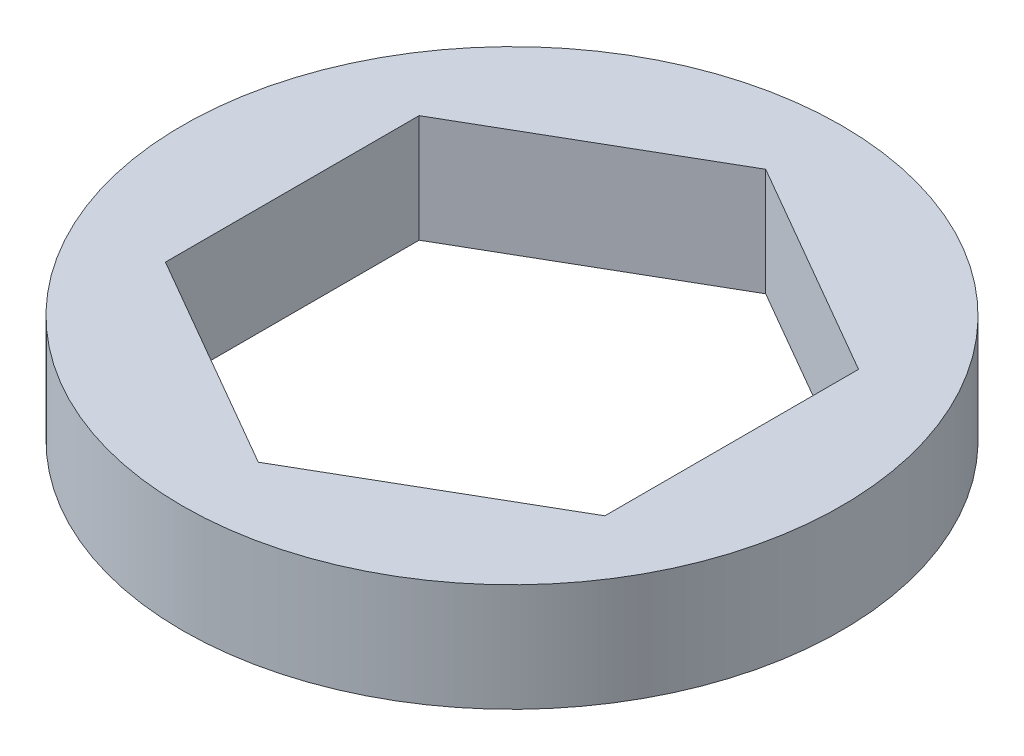
ISO-10303-21;
HEADER;
FILE_DESCRIPTION(('STEP AP214'),'2;1');
FILE_NAME('part.step','',(''),(''),'','','');
FILE_SCHEMA(('AUTOMOTIVE_DESIGN { 1 0 10303 214 1 1 1 1 }'));
ENDSEC;
DATA;
#1=APPLICATION_CONTEXT('core data for automotive mechanical design processes');
#2=APPLICATION_PROTOCOL_DEFINITION('international standard','automotive_design',2000,#1);
#3=PRODUCT_CONTEXT('',#1,'mechanical');
#4=PRODUCT('Part','Part','',(#3));
#5=PRODUCT_RELATED_PRODUCT_CATEGORY('part','',(#4));
#6=PRODUCT_DEFINITION_FORMATION('','',#4);
#7=PRODUCT_DEFINITION_CONTEXT('part definition',#1,'design');
#8=PRODUCT_DEFINITION('design','',#6,#7);
#9=PRODUCT_DEFINITION_SHAPE('','',#8);
#10=(LENGTH_UNIT() NAMED_UNIT(*) SI_UNIT(.MILLI.,.METRE.));
#11=(NAMED_UNIT(*) PLANE_ANGLE_UNIT() SI_UNIT($,.RADIAN.));
#12=(NAMED_UNIT(*) SI_UNIT($,.STERADIAN.) SOLID_ANGLE_UNIT());
#13=UNCERTAINTY_MEASURE_WITH_UNIT(LENGTH_MEASURE(1.E-05),#10,'distance_accuracy_value','');
#14=(GEOMETRIC_REPRESENTATION_CONTEXT(3) GLOBAL_UNCERTAINTY_ASSIGNED_CONTEXT((#13)) GLOBAL_UNIT_ASSIGNED_CONTEXT((#10,
#11,#12)) REPRESENTATION_CONTEXT('',''));
#15=CARTESIAN_POINT('',(0.,0.,0.));
#16=DIRECTION('',(0.,0.,1.));
#17=DIRECTION('',(1.,0.,0.));
#18=AXIS2_PLACEMENT_3D('',#15,#16,#17);
#19=CARTESIAN_POINT('',(0.,3.11785,0.));
#20=DIRECTION('',(0.,1.,0.));
#21=DIRECTION('',(0.,0.,1.));
#22=AXIS2_PLACEMENT_3D('',#19,#20,#21);
#23=PLANE('',#22);
#24=CARTESIAN_POINT('',(0.,3.11785,0.));
#25=DIRECTION('',(0.,1.,0.));
#26=DIRECTION('',(0.,0.,1.));
#27=AXIS2_PLACEMENT_3D('',#24,#25,#26);
#28=CIRCLE('',#27,9.525);
#29=CARTESIAN_POINT('',(0.,3.11785,9.525));
#30=VERTEX_POINT('',#29);
#31=EDGE_CURVE('E11',#30,#30,#28,.T.);
#32=ORIENTED_EDGE('',*,*,#31,.T.);
#33=EDGE_LOOP('',(#32));
#34=FACE_BOUND('',#33,.T.);
#35=DIRECTION('',(-0.866025403784439,0.,0.5));
#36=VECTOR('',#35,1.);
#37=CARTESIAN_POINT('',(0.,3.11785,-7.33234841870825));
#38=LINE('',#37,#36);
#39=CARTESIAN_POINT('',(0.,3.11785,-7.33234841870825));
#40=VERTEX_POINT('',#39);
#41=CARTESIAN_POINT('',(-6.35,3.11785,-3.66617420935412));
#42=VERTEX_POINT('',#41);
#43=EDGE_CURVE('E98',#40,#42,#38,.T.);
#44=ORIENTED_EDGE('',*,*,#43,.F.);
#45=DIRECTION('',(-0.866025403784438,0.,-0.5));
#46=VECTOR('',#45,1.);
#47=CARTESIAN_POINT('',(6.35,3.11785,-3.66617420935412));
#48=LINE('',#47,#46);
#49=CARTESIAN_POINT('',(6.35,3.11785,-3.66617420935412));
#50=VERTEX_POINT('',#49);
#51=EDGE_CURVE('E90',#50,#40,#48,.T.);
#52=ORIENTED_EDGE('',*,*,#51,.F.);
#53=DIRECTION('',(0.,0.,-1.));
#54=VECTOR('',#53,1.);
#55=CARTESIAN_POINT('',(6.35,3.11785,3.66617420935412));
#56=LINE('',#55,#54);
#57=CARTESIAN_POINT('',(6.35,3.11785,3.66617420935412));
#58=VERTEX_POINT('',#57);
#59=EDGE_CURVE('E118',#58,#50,#56,.T.);
#60=ORIENTED_EDGE('',*,*,#59,.F.);
#61=DIRECTION('',(0.866025403784439,0.,-0.5));
#62=VECTOR('',#61,1.);
#63=CARTESIAN_POINT('',(0.,3.11785,7.33234841870825));
#64=LINE('',#63,#62);
#65=CARTESIAN_POINT('',(0.,3.11785,7.33234841870825));
#66=VERTEX_POINT('',#65);
#67=EDGE_CURVE('E116',#66,#58,#64,.T.);
#68=ORIENTED_EDGE('',*,*,#67,.F.);
#69=DIRECTION('',(0.866025403784439,0.,0.5));
#70=VECTOR('',#69,1.);
#71=CARTESIAN_POINT('',(-6.35,3.11785,3.66617420935412));
#72=LINE('',#71,#70);
#73=CARTESIAN_POINT('',(-6.35,3.11785,3.66617420935412));
#74=VERTEX_POINT('',#73);
#75=EDGE_CURVE('E112',#74,#66,#72,.T.);
#76=ORIENTED_EDGE('',*,*,#75,.F.);
#77=DIRECTION('',(0.,0.,1.));
#78=VECTOR('',#77,1.);
#79=CARTESIAN_POINT('',(-6.35,3.11785,-3.66617420935412));
#80=LINE('',#79,#78);
#81=EDGE_CURVE('E110',#42,#74,#80,.T.);
#82=ORIENTED_EDGE('',*,*,#81,.F.);
#83=EDGE_LOOP('',(#44,#52,#60,#68,#76,#82));
#84=FACE_BOUND('',#83,.T.);
#85=ADVANCED_FACE('F37',(#34,#84),#23,.T.);
#86=CARTESIAN_POINT('',(0.,0.,0.));
#87=DIRECTION('',(0.,1.,0.));
#88=DIRECTION('',(0.,0.,1.));
#89=AXIS2_PLACEMENT_3D('',#86,#87,#88);
#90=PLANE('',#89);
#91=CARTESIAN_POINT('',(0.,0.,0.));
#92=DIRECTION('',(0.,1.,0.));
#93=DIRECTION('',(0.,0.,1.));
#94=AXIS2_PLACEMENT_3D('',#91,#92,#93);
#95=CIRCLE('',#94,9.525);
#96=CARTESIAN_POINT('',(0.,0.,9.525));
#97=VERTEX_POINT('',#96);
#98=EDGE_CURVE('E41',#97,#97,#95,.T.);
#99=ORIENTED_EDGE('',*,*,#98,.F.);
#100=EDGE_LOOP('',(#99));
#101=FACE_BOUND('',#100,.T.);
#102=DIRECTION('',(-0.866025403784438,0.,-0.5));
#103=VECTOR('',#102,1.);
#104=CARTESIAN_POINT('',(6.35,0.,-3.66617420935412));
#105=LINE('',#104,#103);
#106=CARTESIAN_POINT('',(6.35,0.,-3.66617420935412));
#107=VERTEX_POINT('',#106);
#108=CARTESIAN_POINT('',(0.,0.,-7.33234841870825));
#109=VERTEX_POINT('',#108);
#110=EDGE_CURVE('E60',#107,#109,#105,.T.);
#111=ORIENTED_EDGE('',*,*,#110,.T.);
#112=DIRECTION('',(-0.866025403784439,0.,0.5));
#113=VECTOR('',#112,1.);
#114=CARTESIAN_POINT('',(0.,0.,-7.33234841870825));
#115=LINE('',#114,#113);
#116=CARTESIAN_POINT('',(-6.35,0.,-3.66617420935412));
#117=VERTEX_POINT('',#116);
#118=EDGE_CURVE('E105',#109,#117,#115,.T.);
#119=ORIENTED_EDGE('',*,*,#118,.T.);
#120=DIRECTION('',(0.,0.,1.));
#121=VECTOR('',#120,1.);
#122=CARTESIAN_POINT('',(-6.35,0.,-3.66617420935412));
#123=LINE('',#122,#121);
#124=CARTESIAN_POINT('',(-6.35,0.,3.66617420935412));
#125=VERTEX_POINT('',#124);
#126=EDGE_CURVE('E122',#117,#125,#123,.T.);
#127=ORIENTED_EDGE('',*,*,#126,.T.);
#128=DIRECTION('',(0.866025403784439,0.,0.5));
#129=VECTOR('',#128,1.);
#130=CARTESIAN_POINT('',(-6.35,0.,3.66617420935412));
#131=LINE('',#130,#129);
#132=CARTESIAN_POINT('',(0.,0.,7.33234841870825));
#133=VERTEX_POINT('',#132);
#134=EDGE_CURVE('E125',#125,#133,#131,.T.);
#135=ORIENTED_EDGE('',*,*,#134,.T.);
#136=DIRECTION('',(0.866025403784439,0.,-0.5));
#137=VECTOR('',#136,1.);
#138=CARTESIAN_POINT('',(0.,0.,7.33234841870825));
#139=LINE('',#138,#137);
#140=CARTESIAN_POINT('',(6.35,0.,3.66617420935412));
#141=VERTEX_POINT('',#140);
#142=EDGE_CURVE('E128',#133,#141,#139,.T.);
#143=ORIENTED_EDGE('',*,*,#142,.T.);
#144=DIRECTION('',(0.,0.,-1.));
#145=VECTOR('',#144,1.);
#146=CARTESIAN_POINT('',(6.35,0.,3.66617420935412));
#147=LINE('',#146,#145);
#148=EDGE_CURVE('E99',#141,#107,#147,.T.);
#149=ORIENTED_EDGE('',*,*,#148,.T.);
#150=EDGE_LOOP('',(#111,#119,#127,#135,#143,#149));
#151=FACE_BOUND('',#150,.T.);
#152=ADVANCED_FACE('F145',(#101,#151),#90,.F.);
#153=CARTESIAN_POINT('',(0.,3.11785,0.));
#154=DIRECTION('',(0.,-1.,0.));
#155=DIRECTION('',(0.,0.,-1.));
#156=AXIS2_PLACEMENT_3D('',#153,#154,#155);
#157=CYLINDRICAL_SURFACE('',#156,9.525);
#158=ORIENTED_EDGE('',*,*,#31,.F.);
#159=EDGE_LOOP('',(#158));
#160=FACE_BOUND('',#159,.T.);
#161=ORIENTED_EDGE('',*,*,#98,.T.);
#162=EDGE_LOOP('',(#161));
#163=FACE_BOUND('',#162,.T.);
#164=ADVANCED_FACE('F39',(#160,#163),#157,.T.);
#165=CARTESIAN_POINT('',(6.35,3.11785,-3.66617420935412));
#166=DIRECTION('',(-0.5,0.,0.866025403784439));
#167=DIRECTION('',(0.866025403784439,0.,0.5));
#168=AXIS2_PLACEMENT_3D('',#165,#166,#167);
#169=PLANE('',#168);
#170=ORIENTED_EDGE('',*,*,#110,.F.);
#171=DIRECTION('',(0.,-1.,0.));
#172=VECTOR('',#171,1.);
#173=CARTESIAN_POINT('',(6.35,3.11785,-3.66617420935412));
#174=LINE('',#173,#172);
#175=EDGE_CURVE('E94',#50,#107,#174,.T.);
#176=ORIENTED_EDGE('',*,*,#175,.F.);
#177=ORIENTED_EDGE('',*,*,#51,.T.);
#178=DIRECTION('',(0.,-1.,0.));
#179=VECTOR('',#178,1.);
#180=CARTESIAN_POINT('',(0.,3.11785,-7.33234841870825));
#181=LINE('',#180,#179);
#182=EDGE_CURVE('E93',#40,#109,#181,.T.);
#183=ORIENTED_EDGE('',*,*,#182,.T.);
#184=EDGE_LOOP('',(#170,#176,#177,#183));
#185=FACE_BOUND('',#184,.T.);
#186=ADVANCED_FACE('F92',(#185),#169,.T.);
#187=CARTESIAN_POINT('',(0.,3.11785,-7.33234841870825));
#188=DIRECTION('',(0.5,0.,0.866025403784439));
#189=DIRECTION('',(0.866025403784439,0.,-0.5));
#190=AXIS2_PLACEMENT_3D('',#187,#188,#189);
#191=PLANE('',#190);
#192=ORIENTED_EDGE('',*,*,#118,.F.);
#193=ORIENTED_EDGE('',*,*,#182,.F.);
#194=ORIENTED_EDGE('',*,*,#43,.T.);
#195=DIRECTION('',(0.,-1.,0.));
#196=VECTOR('',#195,1.);
#197=CARTESIAN_POINT('',(-6.35,3.11785,-3.66617420935412));
#198=LINE('',#197,#196);
#199=EDGE_CURVE('E106',#42,#117,#198,.T.);
#200=ORIENTED_EDGE('',*,*,#199,.T.);
#201=EDGE_LOOP('',(#192,#193,#194,#200));
#202=FACE_BOUND('',#201,.T.);
#203=ADVANCED_FACE('F102',(#202),#191,.T.);
#204=CARTESIAN_POINT('',(-6.35,3.11785,-3.66617420935412));
#205=DIRECTION('',(1.,0.,0.));
#206=DIRECTION('',(0.,0.,-1.));
#207=AXIS2_PLACEMENT_3D('',#204,#205,#206);
#208=PLANE('',#207);
#209=ORIENTED_EDGE('',*,*,#126,.F.);
#210=ORIENTED_EDGE('',*,*,#199,.F.);
#211=ORIENTED_EDGE('',*,*,#81,.T.);
#212=DIRECTION('',(0.,-1.,0.));
#213=VECTOR('',#212,1.);
#214=CARTESIAN_POINT('',(-6.35,3.11785,3.66617420935412));
#215=LINE('',#214,#213);
#216=EDGE_CURVE('E137',#74,#125,#215,.T.);
#217=ORIENTED_EDGE('',*,*,#216,.T.);
#218=EDGE_LOOP('',(#209,#210,#211,#217));
#219=FACE_BOUND('',#218,.T.);
#220=ADVANCED_FACE('F141',(#219),#208,.T.);
#221=CARTESIAN_POINT('',(-6.35,3.11785,3.66617420935412));
#222=DIRECTION('',(0.5,0.,-0.866025403784439));
#223=DIRECTION('',(-0.866025403784439,0.,-0.5));
#224=AXIS2_PLACEMENT_3D('',#221,#222,#223);
#225=PLANE('',#224);
#226=ORIENTED_EDGE('',*,*,#134,.F.);
#227=ORIENTED_EDGE('',*,*,#216,.F.);
#228=ORIENTED_EDGE('',*,*,#75,.T.);
#229=DIRECTION('',(0.,-1.,0.));
#230=VECTOR('',#229,1.);
#231=CARTESIAN_POINT('',(0.,3.11785,7.33234841870825));
#232=LINE('',#231,#230);
#233=EDGE_CURVE('E135',#66,#133,#232,.T.);
#234=ORIENTED_EDGE('',*,*,#233,.T.);
#235=EDGE_LOOP('',(#226,#227,#228,#234));
#236=FACE_BOUND('',#235,.T.);
#237=ADVANCED_FACE('F153',(#236),#225,.T.);
#238=CARTESIAN_POINT('',(0.,3.11785,7.33234841870825));
#239=DIRECTION('',(-0.5,0.,-0.866025403784439));
#240=DIRECTION('',(-0.866025403784439,0.,0.5));
#241=AXIS2_PLACEMENT_3D('',#238,#239,#240);
#242=PLANE('',#241);
#243=ORIENTED_EDGE('',*,*,#142,.F.);
#244=ORIENTED_EDGE('',*,*,#233,.F.);
#245=ORIENTED_EDGE('',*,*,#67,.T.);
#246=DIRECTION('',(0.,-1.,0.));
#247=VECTOR('',#246,1.);
#248=CARTESIAN_POINT('',(6.35,3.11785,3.66617420935412));
#249=LINE('',#248,#247);
#250=EDGE_CURVE('E52',#58,#141,#249,.T.);
#251=ORIENTED_EDGE('',*,*,#250,.T.);
#252=EDGE_LOOP('',(#243,#244,#245,#251));
#253=FACE_BOUND('',#252,.T.);
#254=ADVANCED_FACE('F151',(#253),#242,.T.);
#255=CARTESIAN_POINT('',(6.35,3.11785,3.66617420935412));
#256=DIRECTION('',(-1.,0.,0.));
#257=DIRECTION('',(0.,0.,1.));
#258=AXIS2_PLACEMENT_3D('',#255,#256,#257);
#259=PLANE('',#258);
#260=ORIENTED_EDGE('',*,*,#148,.F.);
#261=ORIENTED_EDGE('',*,*,#250,.F.);
#262=ORIENTED_EDGE('',*,*,#59,.T.);
#263=ORIENTED_EDGE('',*,*,#175,.T.);
#264=EDGE_LOOP('',(#260,#261,#262,#263));
#265=FACE_BOUND('',#264,.T.);
#266=ADVANCED_FACE('F147',(#265),#259,.T.);
#267=CLOSED_SHELL('',(#85,#152,#164,#186,#203,#220,#237,#254,#266));
#268=MANIFOLD_SOLID_BREP('B2',#267);
#269=ADVANCED_BREP_SHAPE_REPRESENTATION('',(#18,#268),#14);
#270=SHAPE_DEFINITION_REPRESENTATION(#9,#269);
ENDSEC;
END-ISO-10303-21;
